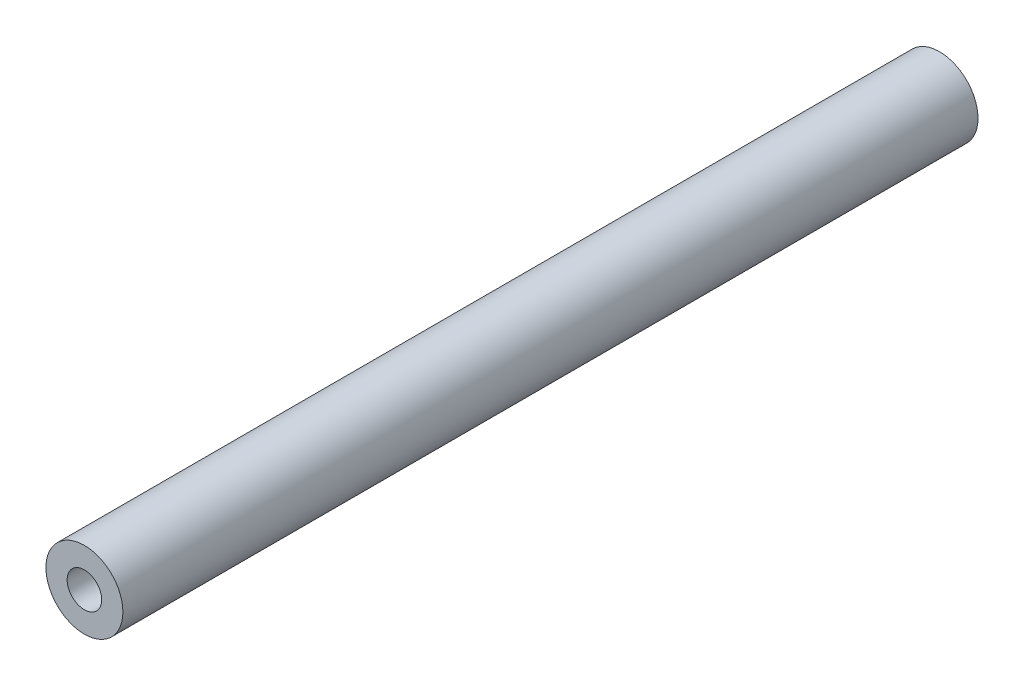
ISO-10303-21;
HEADER;
FILE_DESCRIPTION(('STEP AP214'),'2;1');
FILE_NAME('part.step','',(''),(''),'','','');
FILE_SCHEMA(('AUTOMOTIVE_DESIGN { 1 0 10303 214 1 1 1 1 }'));
ENDSEC;
DATA;
#1=APPLICATION_CONTEXT('core data for automotive mechanical design processes');
#2=APPLICATION_PROTOCOL_DEFINITION('international standard','automotive_design',2000,#1);
#3=PRODUCT_CONTEXT('',#1,'mechanical');
#4=PRODUCT('Part','Part','',(#3));
#5=PRODUCT_RELATED_PRODUCT_CATEGORY('part','',(#4));
#6=PRODUCT_DEFINITION_FORMATION('','',#4);
#7=PRODUCT_DEFINITION_CONTEXT('part definition',#1,'design');
#8=PRODUCT_DEFINITION('design','',#6,#7);
#9=PRODUCT_DEFINITION_SHAPE('','',#8);
#10=(LENGTH_UNIT() NAMED_UNIT(*) SI_UNIT(.MILLI.,.METRE.));
#11=(NAMED_UNIT(*) PLANE_ANGLE_UNIT() SI_UNIT($,.RADIAN.));
#12=(NAMED_UNIT(*) SI_UNIT($,.STERADIAN.) SOLID_ANGLE_UNIT());
#13=UNCERTAINTY_MEASURE_WITH_UNIT(LENGTH_MEASURE(1.E-05),#10,'distance_accuracy_value','');
#14=(GEOMETRIC_REPRESENTATION_CONTEXT(3) GLOBAL_UNCERTAINTY_ASSIGNED_CONTEXT((#13)) GLOBAL_UNIT_ASSIGNED_CONTEXT((#10,
#11,#12)) REPRESENTATION_CONTEXT('',''));
#15=CARTESIAN_POINT('',(0.,0.,0.));
#16=DIRECTION('',(0.,0.,1.));
#17=DIRECTION('',(1.,0.,0.));
#18=AXIS2_PLACEMENT_3D('',#15,#16,#17);
#19=CARTESIAN_POINT('',(0.,0.,100.));
#20=DIRECTION('',(0.,0.,-1.));
#21=DIRECTION('',(-1.,0.,0.));
#22=AXIS2_PLACEMENT_3D('',#19,#20,#21);
#23=CYLINDRICAL_SURFACE('',#22,4.5);
#24=CARTESIAN_POINT('',(0.,0.,100.));
#25=DIRECTION('',(0.,0.,1.));
#26=DIRECTION('',(1.,0.,0.));
#27=AXIS2_PLACEMENT_3D('',#24,#25,#26);
#28=CIRCLE('',#27,4.5);
#29=CARTESIAN_POINT('',(4.5,0.,100.));
#30=VERTEX_POINT('',#29);
#31=EDGE_CURVE('E10',#30,#30,#28,.T.);
#32=ORIENTED_EDGE('',*,*,#31,.F.);
#33=EDGE_LOOP('',(#32));
#34=FACE_BOUND('',#33,.T.);
#35=CARTESIAN_POINT('',(0.,0.,0.));
#36=DIRECTION('',(0.,0.,1.));
#37=DIRECTION('',(1.,0.,0.));
#38=AXIS2_PLACEMENT_3D('',#35,#36,#37);
#39=CIRCLE('',#38,4.5);
#40=CARTESIAN_POINT('',(4.5,0.,0.));
#41=VERTEX_POINT('',#40);
#42=EDGE_CURVE('E48',#41,#41,#39,.T.);
#43=ORIENTED_EDGE('',*,*,#42,.T.);
#44=EDGE_LOOP('',(#43));
#45=FACE_BOUND('',#44,.T.);
#46=ADVANCED_FACE('F41',(#34,#45),#23,.T.);
#47=CARTESIAN_POINT('',(0.,0.,100.));
#48=DIRECTION('',(0.,0.,1.));
#49=DIRECTION('',(1.,0.,0.));
#50=AXIS2_PLACEMENT_3D('',#47,#48,#49);
#51=PLANE('',#50);
#52=CARTESIAN_POINT('',(0.,0.,100.));
#53=DIRECTION('',(0.,0.,1.));
#54=DIRECTION('',(1.,0.,0.));
#55=AXIS2_PLACEMENT_3D('',#52,#53,#54);
#56=CIRCLE('',#55,2.02);
#57=CARTESIAN_POINT('',(2.02,0.,100.));
#58=VERTEX_POINT('',#57);
#59=EDGE_CURVE('E53',#58,#58,#56,.F.);
#60=ORIENTED_EDGE('',*,*,#59,.T.);
#61=EDGE_LOOP('',(#60));
#62=FACE_BOUND('',#61,.T.);
#63=ORIENTED_EDGE('',*,*,#31,.T.);
#64=EDGE_LOOP('',(#63));
#65=FACE_BOUND('',#64,.T.);
#66=ADVANCED_FACE('F66',(#62,#65),#51,.T.);
#67=CARTESIAN_POINT('',(0.,0.,0.));
#68=DIRECTION('',(0.,0.,1.));
#69=DIRECTION('',(1.,0.,0.));
#70=AXIS2_PLACEMENT_3D('',#67,#68,#69);
#71=PLANE('',#70);
#72=CARTESIAN_POINT('',(0.,0.,0.));
#73=DIRECTION('',(0.,0.,1.));
#74=DIRECTION('',(1.,0.,0.));
#75=AXIS2_PLACEMENT_3D('',#72,#73,#74);
#76=CIRCLE('',#75,2.02);
#77=CARTESIAN_POINT('',(2.02,0.,0.));
#78=VERTEX_POINT('',#77);
#79=EDGE_CURVE('E44',#78,#78,#76,.F.);
#80=ORIENTED_EDGE('',*,*,#79,.F.);
#81=EDGE_LOOP('',(#80));
#82=FACE_BOUND('',#81,.T.);
#83=ORIENTED_EDGE('',*,*,#42,.F.);
#84=EDGE_LOOP('',(#83));
#85=FACE_BOUND('',#84,.T.);
#86=ADVANCED_FACE('F63',(#82,#85),#71,.F.);
#87=CARTESIAN_POINT('',(0.,0.,101.));
#88=DIRECTION('',(0.,0.,-1.));
#89=DIRECTION('',(-1.,0.,0.));
#90=AXIS2_PLACEMENT_3D('',#87,#88,#89);
#91=CYLINDRICAL_SURFACE('',#90,2.02);
#92=ORIENTED_EDGE('',*,*,#59,.F.);
#93=EDGE_LOOP('',(#92));
#94=FACE_BOUND('',#93,.T.);
#95=ORIENTED_EDGE('',*,*,#79,.T.);
#96=EDGE_LOOP('',(#95));
#97=FACE_BOUND('',#96,.T.);
#98=ADVANCED_FACE('F61',(#94,#97),#91,.F.);
#99=CLOSED_SHELL('',(#46,#66,#86,#98));
#100=MANIFOLD_SOLID_BREP('B2',#99);
#101=ADVANCED_BREP_SHAPE_REPRESENTATION('',(#18,#100),#14);
#102=SHAPE_DEFINITION_REPRESENTATION(#9,#101);
ENDSEC;
END-ISO-10303-21;
